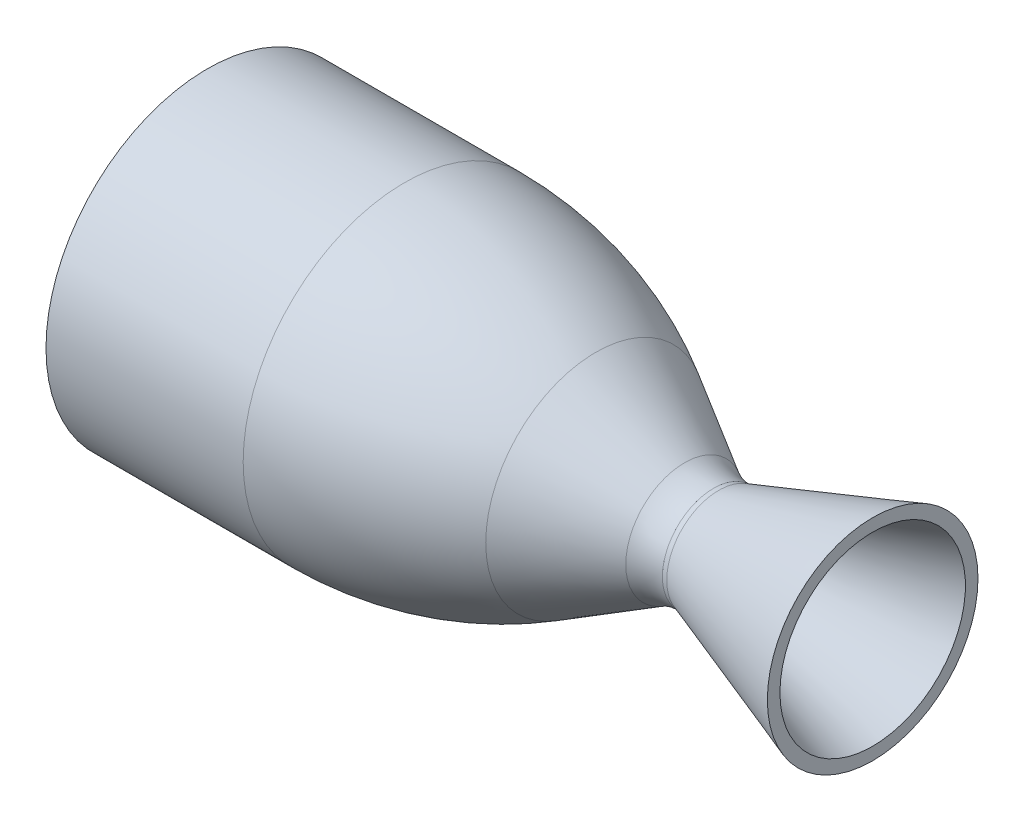
ISO-10303-21;
HEADER;
FILE_DESCRIPTION(('STEP AP214'),'2;1');
FILE_NAME('part.step','',(''),(''),'','','');
FILE_SCHEMA(('AUTOMOTIVE_DESIGN { 1 0 10303 214 1 1 1 1 }'));
ENDSEC;
DATA;
#1=APPLICATION_CONTEXT('core data for automotive mechanical design processes');
#2=APPLICATION_PROTOCOL_DEFINITION('international standard','automotive_design',2000,#1);
#3=PRODUCT_CONTEXT('',#1,'mechanical');
#4=PRODUCT('Part','Part','',(#3));
#5=PRODUCT_RELATED_PRODUCT_CATEGORY('part','',(#4));
#6=PRODUCT_DEFINITION_FORMATION('','',#4);
#7=PRODUCT_DEFINITION_CONTEXT('part definition',#1,'design');
#8=PRODUCT_DEFINITION('design','',#6,#7);
#9=PRODUCT_DEFINITION_SHAPE('','',#8);
#10=(LENGTH_UNIT() NAMED_UNIT(*) SI_UNIT(.MILLI.,.METRE.));
#11=(NAMED_UNIT(*) PLANE_ANGLE_UNIT() SI_UNIT($,.RADIAN.));
#12=(NAMED_UNIT(*) SI_UNIT($,.STERADIAN.) SOLID_ANGLE_UNIT());
#13=UNCERTAINTY_MEASURE_WITH_UNIT(LENGTH_MEASURE(1.E-05),#10,'distance_accuracy_value','');
#14=(GEOMETRIC_REPRESENTATION_CONTEXT(3) GLOBAL_UNCERTAINTY_ASSIGNED_CONTEXT((#13)) GLOBAL_UNIT_ASSIGNED_CONTEXT((#10,
#11,#12)) REPRESENTATION_CONTEXT('',''));
#15=CARTESIAN_POINT('',(0.,0.,0.));
#16=DIRECTION('',(0.,0.,1.));
#17=DIRECTION('',(1.,0.,0.));
#18=AXIS2_PLACEMENT_3D('',#15,#16,#17);
#19=CARTESIAN_POINT('',(0.,0.,0.));
#20=DIRECTION('',(-1.,0.,0.));
#21=DIRECTION('',(0.,0.,1.));
#22=AXIS2_PLACEMENT_3D('',#19,#20,#21);
#23=CYLINDRICAL_SURFACE('',#22,48.395128);
#24=CARTESIAN_POINT('',(64.1413245999998,0.,0.));
#25=DIRECTION('',(-1.,0.,0.));
#26=DIRECTION('',(0.,0.,1.));
#27=AXIS2_PLACEMENT_3D('',#24,#25,#26);
#28=CIRCLE('',#27,48.395128);
#29=CARTESIAN_POINT('',(64.1413245999998,0.,48.395128));
#30=VERTEX_POINT('',#29);
#31=EDGE_CURVE('E96',#30,#30,#28,.T.);
#32=ORIENTED_EDGE('',*,*,#31,.F.);
#33=EDGE_LOOP('',(#32));
#34=FACE_BOUND('',#33,.T.);
#35=CARTESIAN_POINT('',(0.,0.,0.));
#36=DIRECTION('',(-1.,0.,0.));
#37=DIRECTION('',(0.,0.,1.));
#38=AXIS2_PLACEMENT_3D('',#35,#36,#37);
#39=CIRCLE('',#38,48.395128);
#40=CARTESIAN_POINT('',(0.,0.,48.395128));
#41=VERTEX_POINT('',#40);
#42=EDGE_CURVE('E10',#41,#41,#39,.T.);
#43=ORIENTED_EDGE('',*,*,#42,.T.);
#44=EDGE_LOOP('',(#43));
#45=FACE_BOUND('',#44,.T.);
#46=ADVANCED_FACE('F37',(#34,#45),#23,.F.);
#47=CARTESIAN_POINT('',(0.,48.395128,0.));
#48=DIRECTION('',(1.,0.,0.));
#49=DIRECTION('',(0.,0.,-1.));
#50=AXIS2_PLACEMENT_3D('',#47,#48,#49);
#51=PLANE('',#50);
#52=ORIENTED_EDGE('',*,*,#42,.F.);
#53=EDGE_LOOP('',(#52));
#54=FACE_BOUND('',#53,.T.);
#55=CARTESIAN_POINT('',(0.,0.,0.));
#56=DIRECTION('',(-1.,0.,0.));
#57=DIRECTION('',(0.,0.,1.));
#58=AXIS2_PLACEMENT_3D('',#55,#56,#57);
#59=CIRCLE('',#58,52.4820150622349);
#60=CARTESIAN_POINT('',(0.,0.,52.4820150622349));
#61=VERTEX_POINT('',#60);
#62=EDGE_CURVE('E44',#61,#61,#59,.T.);
#63=ORIENTED_EDGE('',*,*,#62,.T.);
#64=EDGE_LOOP('',(#63));
#65=FACE_BOUND('',#64,.T.);
#66=ADVANCED_FACE('F104',(#54,#65),#51,.F.);
#67=CARTESIAN_POINT('',(0.,0.,0.));
#68=DIRECTION('',(-1.,0.,0.));
#69=DIRECTION('',(0.,0.,1.));
#70=AXIS2_PLACEMENT_3D('',#67,#68,#69);
#71=CYLINDRICAL_SURFACE('',#70,52.4820150622349);
#72=ORIENTED_EDGE('',*,*,#62,.F.);
#73=EDGE_LOOP('',(#72));
#74=FACE_BOUND('',#73,.T.);
#75=CARTESIAN_POINT('',(64.1413245999998,0.,0.));
#76=DIRECTION('',(-1.,0.,0.));
#77=DIRECTION('',(0.,0.,1.));
#78=AXIS2_PLACEMENT_3D('',#75,#76,#77);
#79=CIRCLE('',#78,52.4820150622349);
#80=CARTESIAN_POINT('',(64.1413245999998,0.,52.4820150622349));
#81=VERTEX_POINT('',#80);
#82=EDGE_CURVE('E49',#81,#81,#79,.T.);
#83=ORIENTED_EDGE('',*,*,#82,.T.);
#84=EDGE_LOOP('',(#83));
#85=FACE_BOUND('',#84,.T.);
#86=ADVANCED_FACE('F108',(#74,#85),#71,.T.);
#87=CARTESIAN_POINT('',(64.1413245999998,0.,0.));
#88=DIRECTION('',(-1.,0.,0.));
#89=DIRECTION('',(0.,0.,1.));
#90=AXIS2_PLACEMENT_3D('',#87,#88,#89);
#91=DEGENERATE_TOROIDAL_SURFACE('',#90,71.9761443498547,124.45815941209,.F.);
#92=ORIENTED_EDGE('',*,*,#82,.F.);
#93=EDGE_LOOP('',(#92));
#94=FACE_BOUND('',#93,.T.);
#95=CARTESIAN_POINT('',(126.3704864,0.,0.));
#96=DIRECTION('',(-1.,0.,0.));
#97=DIRECTION('',(0.,0.,1.));
#98=AXIS2_PLACEMENT_3D('',#95,#96,#97);
#99=CIRCLE('',#98,35.8077360122592);
#100=CARTESIAN_POINT('',(126.3704864,0.,35.8077360122592));
#101=VERTEX_POINT('',#100);
#102=EDGE_CURVE('E54',#101,#101,#99,.T.);
#103=ORIENTED_EDGE('',*,*,#102,.T.);
#104=EDGE_LOOP('',(#103));
#105=FACE_BOUND('',#104,.T.);
#106=ADVANCED_FACE('F113',(#94,#105),#91,.F.);
#107=CARTESIAN_POINT('',(155.25115,0.,0.));
#108=DIRECTION('',(-1.,0.,0.));
#109=DIRECTION('',(0.,0.,1.));
#110=AXIS2_PLACEMENT_3D('',#107,#108,#109);
#111=CONICAL_SURFACE('',#110,19.1334914622348,0.52359840284508);
#112=ORIENTED_EDGE('',*,*,#102,.F.);
#113=EDGE_LOOP('',(#112));
#114=FACE_BOUND('',#113,.T.);
#115=CARTESIAN_POINT('',(155.25115,0.,0.));
#116=DIRECTION('',(-1.,0.,0.));
#117=DIRECTION('',(0.,0.,1.));
#118=AXIS2_PLACEMENT_3D('',#115,#116,#117);
#119=CIRCLE('',#118,19.1334914622348);
#120=CARTESIAN_POINT('',(155.25115,0.,19.1334914622348));
#121=VERTEX_POINT('',#120);
#122=EDGE_CURVE('E60',#121,#121,#119,.T.);
#123=ORIENTED_EDGE('',*,*,#122,.T.);
#124=EDGE_LOOP('',(#123));
#125=FACE_BOUND('',#124,.T.);
#126=ADVANCED_FACE('F119',(#114,#125),#111,.T.);
#127=CARTESIAN_POINT('',(164.647716021453,0.,0.));
#128=DIRECTION('',(-1.,0.,0.));
#129=DIRECTION('',(0.,0.,1.));
#130=AXIS2_PLACEMENT_3D('',#127,#128,#129);
#131=TOROIDAL_SURFACE('',#130,35.4088352384769,18.7931441762785);
#132=ORIENTED_EDGE('',*,*,#122,.F.);
#133=EDGE_LOOP('',(#132));
#134=FACE_BOUND('',#133,.T.);
#135=CARTESIAN_POINT('',(164.647753,0.,0.));
#136=DIRECTION('',(-1.,0.,0.));
#137=DIRECTION('',(0.,0.,1.));
#138=AXIS2_PLACEMENT_3D('',#135,#136,#137);
#139=CIRCLE('',#138,16.6156910622348);
#140=CARTESIAN_POINT('',(164.647753,0.,16.6156910622348));
#141=VERTEX_POINT('',#140);
#142=EDGE_CURVE('E64',#141,#141,#139,.T.);
#143=ORIENTED_EDGE('',*,*,#142,.T.);
#144=EDGE_LOOP('',(#143));
#145=FACE_BOUND('',#144,.T.);
#146=ADVANCED_FACE('F123',(#134,#145),#131,.F.);
#147=CARTESIAN_POINT('',(166.354248118231,0.,0.));
#148=DIRECTION('',(1.,0.,0.));
#149=DIRECTION('',(0.,0.,-1.));
#150=AXIS2_PLACEMENT_3D('',#147,#148,#149);
#151=CONICAL_SURFACE('',#150,16.9073761222708,0.16929039408928);
#152=ORIENTED_EDGE('',*,*,#142,.F.);
#153=EDGE_LOOP('',(#152));
#154=FACE_BOUND('',#153,.T.);
#155=CARTESIAN_POINT('',(166.354248118231,0.,0.));
#156=DIRECTION('',(-1.,0.,0.));
#157=DIRECTION('',(0.,0.,1.));
#158=AXIS2_PLACEMENT_3D('',#155,#156,#157);
#159=CIRCLE('',#158,16.9073761222708);
#160=CARTESIAN_POINT('',(166.354248118231,0.,16.9073761222708));
#161=VERTEX_POINT('',#160);
#162=EDGE_CURVE('E68',#161,#161,#159,.T.);
#163=ORIENTED_EDGE('',*,*,#162,.T.);
#164=EDGE_LOOP('',(#163));
#165=FACE_BOUND('',#164,.T.);
#166=ADVANCED_FACE('F127',(#154,#165),#151,.T.);
#167=CARTESIAN_POINT('',(216.430424318231,0.,0.));
#168=DIRECTION('',(1.,0.,0.));
#169=DIRECTION('',(0.,0.,-1.));
#170=AXIS2_PLACEMENT_3D('',#167,#168,#169);
#171=CONICAL_SURFACE('',#170,34.2602259845056,0.333579320494228);
#172=ORIENTED_EDGE('',*,*,#162,.F.);
#173=EDGE_LOOP('',(#172));
#174=FACE_BOUND('',#173,.T.);
#175=CARTESIAN_POINT('',(216.430424318231,0.,0.));
#176=DIRECTION('',(-1.,0.,0.));
#177=DIRECTION('',(0.,0.,1.));
#178=AXIS2_PLACEMENT_3D('',#175,#176,#177);
#179=CIRCLE('',#178,34.2602259845056);
#180=CARTESIAN_POINT('',(216.430424318231,0.,34.2602259845056));
#181=VERTEX_POINT('',#180);
#182=EDGE_CURVE('E72',#181,#181,#179,.T.);
#183=ORIENTED_EDGE('',*,*,#182,.T.);
#184=EDGE_LOOP('',(#183));
#185=FACE_BOUND('',#184,.T.);
#186=ADVANCED_FACE('F131',(#174,#185),#171,.T.);
#187=CARTESIAN_POINT('',(216.430424318231,34.2602259845056,0.));
#188=DIRECTION('',(-1.,0.,0.));
#189=DIRECTION('',(0.,0.,1.));
#190=AXIS2_PLACEMENT_3D('',#187,#188,#189);
#191=PLANE('',#190);
#192=ORIENTED_EDGE('',*,*,#182,.F.);
#193=EDGE_LOOP('',(#192));
#194=FACE_BOUND('',#193,.T.);
#195=CARTESIAN_POINT('',(216.430424318231,0.,0.));
#196=DIRECTION('',(-1.,0.,0.));
#197=DIRECTION('',(0.,0.,1.));
#198=AXIS2_PLACEMENT_3D('',#195,#196,#197);
#199=CIRCLE('',#198,30.1733389222708);
#200=CARTESIAN_POINT('',(216.430424318231,0.,30.1733389222708));
#201=VERTEX_POINT('',#200);
#202=EDGE_CURVE('E76',#201,#201,#199,.T.);
#203=ORIENTED_EDGE('',*,*,#202,.T.);
#204=EDGE_LOOP('',(#203));
#205=FACE_BOUND('',#204,.T.);
#206=ADVANCED_FACE('F135',(#194,#205),#191,.F.);
#207=CARTESIAN_POINT('',(166.354248118231,0.,0.));
#208=DIRECTION('',(1.,0.,0.));
#209=DIRECTION('',(0.,0.,-1.));
#210=AXIS2_PLACEMENT_3D('',#207,#208,#209);
#211=CONICAL_SURFACE('',#210,12.8433761222708,0.333171216999185);
#212=ORIENTED_EDGE('',*,*,#202,.F.);
#213=EDGE_LOOP('',(#212));
#214=FACE_BOUND('',#213,.T.);
#215=CARTESIAN_POINT('',(166.354248118231,0.,0.));
#216=DIRECTION('',(-1.,0.,0.));
#217=DIRECTION('',(0.,0.,1.));
#218=AXIS2_PLACEMENT_3D('',#215,#216,#217);
#219=CIRCLE('',#218,12.8433761222708);
#220=CARTESIAN_POINT('',(166.354248118231,0.,12.8433761222708));
#221=VERTEX_POINT('',#220);
#222=EDGE_CURVE('E80',#221,#221,#219,.T.);
#223=ORIENTED_EDGE('',*,*,#222,.T.);
#224=EDGE_LOOP('',(#223));
#225=FACE_BOUND('',#224,.T.);
#226=ADVANCED_FACE('F139',(#214,#225),#211,.F.);
#227=CARTESIAN_POINT('',(164.466461504674,0.,0.));
#228=DIRECTION('',(-1.,0.,0.));
#229=DIRECTION('',(0.,0.,1.));
#230=AXIS2_PLACEMENT_3D('',#227,#228,#229);
#231=TOROIDAL_SURFACE('',#230,18.2982715643115,5.77231518386863);
#232=ORIENTED_EDGE('',*,*,#222,.F.);
#233=EDGE_LOOP('',(#232));
#234=FACE_BOUND('',#233,.T.);
#235=CARTESIAN_POINT('',(164.647753,0.,0.));
#236=DIRECTION('',(-1.,0.,0.));
#237=DIRECTION('',(0.,0.,1.));
#238=AXIS2_PLACEMENT_3D('',#235,#236,#237);
#239=CIRCLE('',#238,12.528804);
#240=CARTESIAN_POINT('',(164.647753,0.,12.528804));
#241=VERTEX_POINT('',#240);
#242=EDGE_CURVE('E84',#241,#241,#239,.T.);
#243=ORIENTED_EDGE('',*,*,#242,.T.);
#244=EDGE_LOOP('',(#243));
#245=FACE_BOUND('',#244,.T.);
#246=ADVANCED_FACE('F143',(#234,#245),#231,.T.);
#247=CARTESIAN_POINT('',(164.119203415729,0.,0.));
#248=DIRECTION('',(-1.,0.,0.));
#249=DIRECTION('',(0.,0.,1.));
#250=AXIS2_PLACEMENT_3D('',#247,#248,#249);
#251=TOROIDAL_SURFACE('',#250,29.3495030465641,16.8290011907455);
#252=ORIENTED_EDGE('',*,*,#242,.F.);
#253=EDGE_LOOP('',(#252));
#254=FACE_BOUND('',#253,.T.);
#255=CARTESIAN_POINT('',(155.25115,0.,0.));
#256=DIRECTION('',(-1.,0.,0.));
#257=DIRECTION('',(0.,0.,1.));
#258=AXIS2_PLACEMENT_3D('',#255,#256,#257);
#259=CIRCLE('',#258,15.0466044);
#260=CARTESIAN_POINT('',(155.25115,0.,15.0466044));
#261=VERTEX_POINT('',#260);
#262=EDGE_CURVE('E88',#261,#261,#259,.T.);
#263=ORIENTED_EDGE('',*,*,#262,.T.);
#264=EDGE_LOOP('',(#263));
#265=FACE_BOUND('',#264,.T.);
#266=ADVANCED_FACE('F147',(#254,#265),#251,.T.);
#267=CARTESIAN_POINT('',(126.3704864,0.,0.));
#268=DIRECTION('',(-1.,0.,0.));
#269=DIRECTION('',(0.,0.,1.));
#270=AXIS2_PLACEMENT_3D('',#267,#268,#269);
#271=CONICAL_SURFACE('',#270,31.7208489500244,0.52359840284508);
#272=ORIENTED_EDGE('',*,*,#262,.F.);
#273=EDGE_LOOP('',(#272));
#274=FACE_BOUND('',#273,.T.);
#275=CARTESIAN_POINT('',(126.3704864,0.,0.));
#276=DIRECTION('',(-1.,0.,0.));
#277=DIRECTION('',(0.,0.,1.));
#278=AXIS2_PLACEMENT_3D('',#275,#276,#277);
#279=CIRCLE('',#278,31.7208489500244);
#280=CARTESIAN_POINT('',(126.3704864,0.,31.7208489500244));
#281=VERTEX_POINT('',#280);
#282=EDGE_CURVE('E92',#281,#281,#279,.T.);
#283=ORIENTED_EDGE('',*,*,#282,.T.);
#284=EDGE_LOOP('',(#283));
#285=FACE_BOUND('',#284,.T.);
#286=ADVANCED_FACE('F151',(#274,#285),#271,.F.);
#287=CARTESIAN_POINT('',(64.141183413267,0.,0.));
#288=DIRECTION('',(-1.,0.,0.));
#289=DIRECTION('',(0.,0.,1.));
#290=AXIS2_PLACEMENT_3D('',#287,#288,#289);
#291=DEGENERATE_TOROIDAL_SURFACE('',#290,76.0635583273467,124.458686327427,.F.);
#292=ORIENTED_EDGE('',*,*,#282,.F.);
#293=EDGE_LOOP('',(#292));
#294=FACE_BOUND('',#293,.T.);
#295=ORIENTED_EDGE('',*,*,#31,.T.);
#296=EDGE_LOOP('',(#295));
#297=FACE_BOUND('',#296,.T.);
#298=ADVANCED_FACE('F101',(#294,#297),#291,.T.);
#299=CLOSED_SHELL('',(#46,#66,#86,#106,#126,#146,#166,#186,#206,#226,#246,#266,#286,#298));
#300=MANIFOLD_SOLID_BREP('B2',#299);
#301=ADVANCED_BREP_SHAPE_REPRESENTATION('',(#18,#300),#14);
#302=SHAPE_DEFINITION_REPRESENTATION(#9,#301);
ENDSEC;
END-ISO-10303-21;
